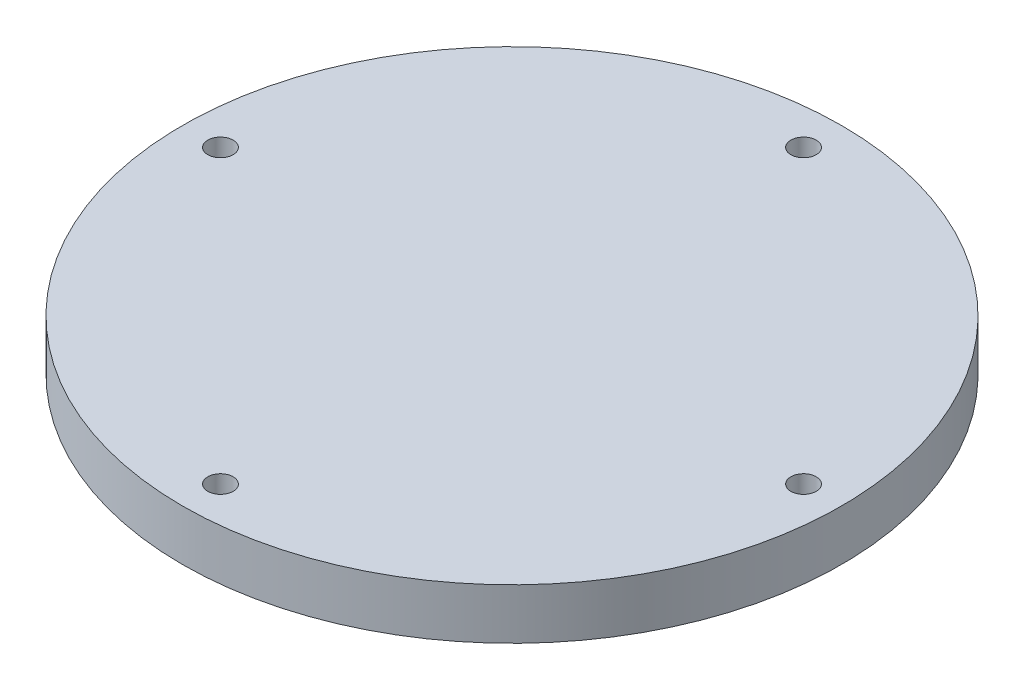
ISO-10303-21;
HEADER;
FILE_DESCRIPTION(('STEP AP214'),'2;1');
FILE_NAME('part.step','',(''),(''),'','','');
FILE_SCHEMA(('AUTOMOTIVE_DESIGN { 1 0 10303 214 1 1 1 1 }'));
ENDSEC;
DATA;
#1=APPLICATION_CONTEXT('core data for automotive mechanical design processes');
#2=APPLICATION_PROTOCOL_DEFINITION('international standard','automotive_design',2000,#1);
#3=PRODUCT_CONTEXT('',#1,'mechanical');
#4=PRODUCT('Part','Part','',(#3));
#5=PRODUCT_RELATED_PRODUCT_CATEGORY('part','',(#4));
#6=PRODUCT_DEFINITION_FORMATION('','',#4);
#7=PRODUCT_DEFINITION_CONTEXT('part definition',#1,'design');
#8=PRODUCT_DEFINITION('design','',#6,#7);
#9=PRODUCT_DEFINITION_SHAPE('','',#8);
#10=(LENGTH_UNIT() NAMED_UNIT(*) SI_UNIT(.MILLI.,.METRE.));
#11=(NAMED_UNIT(*) PLANE_ANGLE_UNIT() SI_UNIT($,.RADIAN.));
#12=(NAMED_UNIT(*) SI_UNIT($,.STERADIAN.) SOLID_ANGLE_UNIT());
#13=UNCERTAINTY_MEASURE_WITH_UNIT(LENGTH_MEASURE(1.E-05),#10,'distance_accuracy_value','');
#14=(GEOMETRIC_REPRESENTATION_CONTEXT(3) GLOBAL_UNCERTAINTY_ASSIGNED_CONTEXT((#13)) GLOBAL_UNIT_ASSIGNED_CONTEXT((#10,
#11,#12)) REPRESENTATION_CONTEXT('',''));
#15=CARTESIAN_POINT('',(0.,0.,0.));
#16=DIRECTION('',(0.,0.,1.));
#17=DIRECTION('',(1.,0.,0.));
#18=AXIS2_PLACEMENT_3D('',#15,#16,#17);
#19=CARTESIAN_POINT('',(0.,10.,0.));
#20=DIRECTION('',(0.,-1.,0.));
#21=DIRECTION('',(0.,0.,-1.));
#22=AXIS2_PLACEMENT_3D('',#19,#20,#21);
#23=CYLINDRICAL_SURFACE('',#22,65.);
#24=CARTESIAN_POINT('',(0.,10.,0.));
#25=DIRECTION('',(0.,1.,0.));
#26=DIRECTION('',(0.,0.,1.));
#27=AXIS2_PLACEMENT_3D('',#24,#25,#26);
#28=CIRCLE('',#27,65.);
#29=CARTESIAN_POINT('',(0.,10.,65.));
#30=VERTEX_POINT('',#29);
#31=EDGE_CURVE('E10',#30,#30,#28,.T.);
#32=ORIENTED_EDGE('',*,*,#31,.F.);
#33=EDGE_LOOP('',(#32));
#34=FACE_BOUND('',#33,.T.);
#35=CARTESIAN_POINT('',(0.,0.,0.));
#36=DIRECTION('',(0.,1.,0.));
#37=DIRECTION('',(0.,0.,1.));
#38=AXIS2_PLACEMENT_3D('',#35,#36,#37);
#39=CIRCLE('',#38,65.);
#40=CARTESIAN_POINT('',(0.,0.,65.));
#41=VERTEX_POINT('',#40);
#42=EDGE_CURVE('E43',#41,#41,#39,.T.);
#43=ORIENTED_EDGE('',*,*,#42,.T.);
#44=EDGE_LOOP('',(#43));
#45=FACE_BOUND('',#44,.T.);
#46=ADVANCED_FACE('F40',(#34,#45),#23,.T.);
#47=CARTESIAN_POINT('',(0.,10.,0.));
#48=DIRECTION('',(0.,1.,0.));
#49=DIRECTION('',(0.,0.,1.));
#50=AXIS2_PLACEMENT_3D('',#47,#48,#49);
#51=PLANE('',#50);
#52=CARTESIAN_POINT('',(0.,10.,-57.5));
#53=DIRECTION('',(0.,1.,0.));
#54=DIRECTION('',(0.,0.,1.));
#55=AXIS2_PLACEMENT_3D('',#52,#53,#54);
#56=CIRCLE('',#55,2.5);
#57=CARTESIAN_POINT('',(0.,10.,-55.));
#58=VERTEX_POINT('',#57);
#59=EDGE_CURVE('E78',#58,#58,#56,.T.);
#60=ORIENTED_EDGE('',*,*,#59,.F.);
#61=EDGE_LOOP('',(#60));
#62=FACE_BOUND('',#61,.T.);
#63=CARTESIAN_POINT('',(57.5000000000016,10.,-1.62368571360558E-12));
#64=DIRECTION('',(0.,1.,0.));
#65=DIRECTION('',(0.,0.,1.));
#66=AXIS2_PLACEMENT_3D('',#63,#64,#65);
#67=CIRCLE('',#66,2.50000000000127);
#68=CARTESIAN_POINT('',(57.5000000000016,10.,2.49999999999965));
#69=VERTEX_POINT('',#68);
#70=EDGE_CURVE('E74',#69,#69,#67,.T.);
#71=ORIENTED_EDGE('',*,*,#70,.F.);
#72=EDGE_LOOP('',(#71));
#73=FACE_BOUND('',#72,.T.);
#74=CARTESIAN_POINT('',(3.24737142721117E-12,10.,57.5));
#75=DIRECTION('',(0.,1.,0.));
#76=DIRECTION('',(0.,0.,1.));
#77=AXIS2_PLACEMENT_3D('',#74,#75,#76);
#78=CIRCLE('',#77,2.50000000000349);
#79=CARTESIAN_POINT('',(3.24737142721117E-12,10.,60.0000000000035));
#80=VERTEX_POINT('',#79);
#81=EDGE_CURVE('E66',#80,#80,#78,.T.);
#82=ORIENTED_EDGE('',*,*,#81,.F.);
#83=EDGE_LOOP('',(#82));
#84=FACE_BOUND('',#83,.T.);
#85=CARTESIAN_POINT('',(-57.4999999999984,10.,1.63072743270068E-12));
#86=DIRECTION('',(0.,1.,0.));
#87=DIRECTION('',(0.,0.,1.));
#88=AXIS2_PLACEMENT_3D('',#85,#86,#87);
#89=CIRCLE('',#88,2.50000000000261);
#90=CARTESIAN_POINT('',(-57.4999999999984,10.,2.50000000000424));
#91=VERTEX_POINT('',#90);
#92=EDGE_CURVE('E58',#91,#91,#89,.T.);
#93=ORIENTED_EDGE('',*,*,#92,.F.);
#94=EDGE_LOOP('',(#93));
#95=FACE_BOUND('',#94,.T.);
#96=ORIENTED_EDGE('',*,*,#31,.T.);
#97=EDGE_LOOP('',(#96));
#98=FACE_BOUND('',#97,.T.);
#99=ADVANCED_FACE('F96',(#62,#73,#84,#95,#98),#51,.T.);
#100=CARTESIAN_POINT('',(0.,0.,0.));
#101=DIRECTION('',(0.,1.,0.));
#102=DIRECTION('',(0.,0.,1.));
#103=AXIS2_PLACEMENT_3D('',#100,#101,#102);
#104=PLANE('',#103);
#105=CARTESIAN_POINT('',(0.,0.,-57.5));
#106=DIRECTION('',(0.,1.,0.));
#107=DIRECTION('',(0.,0.,1.));
#108=AXIS2_PLACEMENT_3D('',#105,#106,#107);
#109=CIRCLE('',#108,2.5);
#110=CARTESIAN_POINT('',(0.,0.,-55.));
#111=VERTEX_POINT('',#110);
#112=EDGE_CURVE('E52',#111,#111,#109,.T.);
#113=ORIENTED_EDGE('',*,*,#112,.T.);
#114=EDGE_LOOP('',(#113));
#115=FACE_BOUND('',#114,.T.);
#116=CARTESIAN_POINT('',(57.5000000000016,0.,-1.62368571360558E-12));
#117=DIRECTION('',(0.,1.,0.));
#118=DIRECTION('',(0.,0.,1.));
#119=AXIS2_PLACEMENT_3D('',#116,#117,#118);
#120=CIRCLE('',#119,2.50000000000127);
#121=CARTESIAN_POINT('',(57.5000000000016,0.,2.49999999999965));
#122=VERTEX_POINT('',#121);
#123=EDGE_CURVE('E70',#122,#122,#120,.T.);
#124=ORIENTED_EDGE('',*,*,#123,.T.);
#125=EDGE_LOOP('',(#124));
#126=FACE_BOUND('',#125,.T.);
#127=CARTESIAN_POINT('',(3.24737142721117E-12,0.,57.5));
#128=DIRECTION('',(0.,1.,0.));
#129=DIRECTION('',(0.,0.,1.));
#130=AXIS2_PLACEMENT_3D('',#127,#128,#129);
#131=CIRCLE('',#130,2.50000000000349);
#132=CARTESIAN_POINT('',(3.24737142721117E-12,0.,60.0000000000035));
#133=VERTEX_POINT('',#132);
#134=EDGE_CURVE('E62',#133,#133,#131,.T.);
#135=ORIENTED_EDGE('',*,*,#134,.T.);
#136=EDGE_LOOP('',(#135));
#137=FACE_BOUND('',#136,.T.);
#138=CARTESIAN_POINT('',(-57.4999999999984,0.,1.63072743270068E-12));
#139=DIRECTION('',(0.,1.,0.));
#140=DIRECTION('',(0.,0.,1.));
#141=AXIS2_PLACEMENT_3D('',#138,#139,#140);
#142=CIRCLE('',#141,2.50000000000261);
#143=CARTESIAN_POINT('',(-57.4999999999984,0.,2.50000000000424));
#144=VERTEX_POINT('',#143);
#145=EDGE_CURVE('E54',#144,#144,#142,.T.);
#146=ORIENTED_EDGE('',*,*,#145,.T.);
#147=EDGE_LOOP('',(#146));
#148=FACE_BOUND('',#147,.T.);
#149=ORIENTED_EDGE('',*,*,#42,.F.);
#150=EDGE_LOOP('',(#149));
#151=FACE_BOUND('',#150,.T.);
#152=ADVANCED_FACE('F86',(#115,#126,#137,#148,#151),#104,.F.);
#153=CARTESIAN_POINT('',(-57.4999999999984,0.,1.63072743270068E-12));
#154=DIRECTION('',(0.,1.,0.));
#155=DIRECTION('',(0.,0.,1.));
#156=AXIS2_PLACEMENT_3D('',#153,#154,#155);
#157=CYLINDRICAL_SURFACE('',#156,2.50000000000261);
#158=ORIENTED_EDGE('',*,*,#145,.F.);
#159=EDGE_LOOP('',(#158));
#160=FACE_BOUND('',#159,.T.);
#161=ORIENTED_EDGE('',*,*,#92,.T.);
#162=EDGE_LOOP('',(#161));
#163=FACE_BOUND('',#162,.T.);
#164=ADVANCED_FACE('F106',(#160,#163),#157,.F.);
#165=CARTESIAN_POINT('',(3.24737142721117E-12,0.,57.5));
#166=DIRECTION('',(0.,1.,0.));
#167=DIRECTION('',(0.,0.,1.));
#168=AXIS2_PLACEMENT_3D('',#165,#166,#167);
#169=CYLINDRICAL_SURFACE('',#168,2.50000000000349);
#170=ORIENTED_EDGE('',*,*,#134,.F.);
#171=EDGE_LOOP('',(#170));
#172=FACE_BOUND('',#171,.T.);
#173=ORIENTED_EDGE('',*,*,#81,.T.);
#174=EDGE_LOOP('',(#173));
#175=FACE_BOUND('',#174,.T.);
#176=ADVANCED_FACE('F108',(#172,#175),#169,.F.);
#177=CARTESIAN_POINT('',(57.5000000000016,0.,-1.62368571360558E-12));
#178=DIRECTION('',(0.,1.,0.));
#179=DIRECTION('',(0.,0.,1.));
#180=AXIS2_PLACEMENT_3D('',#177,#178,#179);
#181=CYLINDRICAL_SURFACE('',#180,2.50000000000127);
#182=ORIENTED_EDGE('',*,*,#123,.F.);
#183=EDGE_LOOP('',(#182));
#184=FACE_BOUND('',#183,.T.);
#185=ORIENTED_EDGE('',*,*,#70,.T.);
#186=EDGE_LOOP('',(#185));
#187=FACE_BOUND('',#186,.T.);
#188=ADVANCED_FACE('F92',(#184,#187),#181,.F.);
#189=CARTESIAN_POINT('',(0.,0.,-57.5));
#190=DIRECTION('',(0.,1.,0.));
#191=DIRECTION('',(0.,0.,1.));
#192=AXIS2_PLACEMENT_3D('',#189,#190,#191);
#193=CYLINDRICAL_SURFACE('',#192,2.5);
#194=ORIENTED_EDGE('',*,*,#112,.F.);
#195=EDGE_LOOP('',(#194));
#196=FACE_BOUND('',#195,.T.);
#197=ORIENTED_EDGE('',*,*,#59,.T.);
#198=EDGE_LOOP('',(#197));
#199=FACE_BOUND('',#198,.T.);
#200=ADVANCED_FACE('F89',(#196,#199),#193,.F.);
#201=CLOSED_SHELL('',(#46,#99,#152,#164,#176,#188,#200));
#202=MANIFOLD_SOLID_BREP('B2',#201);
#203=ADVANCED_BREP_SHAPE_REPRESENTATION('',(#18,#202),#14);
#204=SHAPE_DEFINITION_REPRESENTATION(#9,#203);
ENDSEC;
END-ISO-10303-21;
